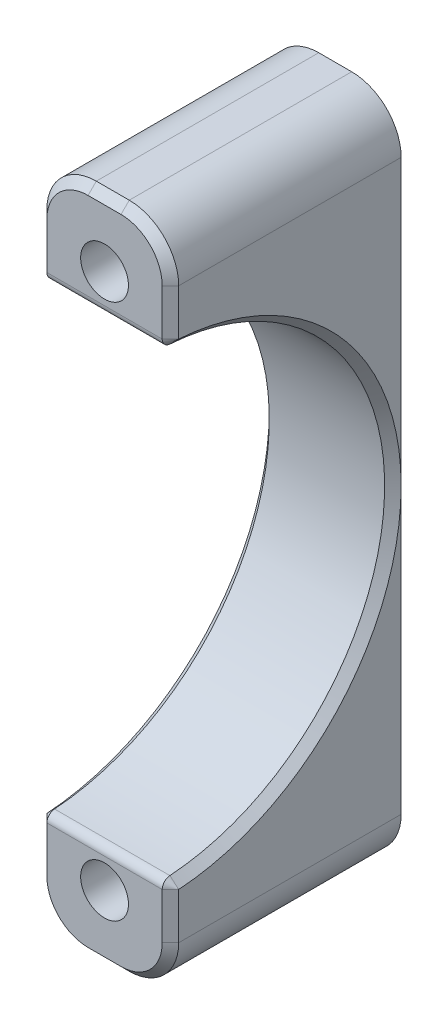
ISO-10303-21;
HEADER;
FILE_DESCRIPTION(('STEP AP214'),'2;1');
FILE_NAME('part.step','',(''),(''),'','','');
FILE_SCHEMA(('AUTOMOTIVE_DESIGN { 1 0 10303 214 1 1 1 1 }'));
ENDSEC;
DATA;
#1=APPLICATION_CONTEXT('core data for automotive mechanical design processes');
#2=APPLICATION_PROTOCOL_DEFINITION('international standard','automotive_design',2000,#1);
#3=PRODUCT_CONTEXT('',#1,'mechanical');
#4=PRODUCT('Part','Part','',(#3));
#5=PRODUCT_RELATED_PRODUCT_CATEGORY('part','',(#4));
#6=PRODUCT_DEFINITION_FORMATION('','',#4);
#7=PRODUCT_DEFINITION_CONTEXT('part definition',#1,'design');
#8=PRODUCT_DEFINITION('design','',#6,#7);
#9=PRODUCT_DEFINITION_SHAPE('','',#8);
#10=(LENGTH_UNIT() NAMED_UNIT(*) SI_UNIT(.MILLI.,.METRE.));
#11=(NAMED_UNIT(*) PLANE_ANGLE_UNIT() SI_UNIT($,.RADIAN.));
#12=(NAMED_UNIT(*) SI_UNIT($,.STERADIAN.) SOLID_ANGLE_UNIT());
#13=UNCERTAINTY_MEASURE_WITH_UNIT(LENGTH_MEASURE(1.E-05),#10,'distance_accuracy_value','');
#14=(GEOMETRIC_REPRESENTATION_CONTEXT(3) GLOBAL_UNCERTAINTY_ASSIGNED_CONTEXT((#13)) GLOBAL_UNIT_ASSIGNED_CONTEXT((#10,
#11,#12)) REPRESENTATION_CONTEXT('',''));
#15=CARTESIAN_POINT('',(0.,0.,0.));
#16=DIRECTION('',(0.,0.,1.));
#17=DIRECTION('',(1.,0.,0.));
#18=AXIS2_PLACEMENT_3D('',#15,#16,#17);
#19=CARTESIAN_POINT('',(148.26488013173,17.2640458755163,14.));
#20=DIRECTION('',(1.,0.,0.));
#21=DIRECTION('',(0.,0.,-1.));
#22=AXIS2_PLACEMENT_3D('',#19,#20,#21);
#23=PLANE('',#22);
#24=DIRECTION('',(0.,0.,-1.));
#25=VECTOR('',#24,1.);
#26=CARTESIAN_POINT('',(148.26488013173,-17.2640458755164,14.));
#27=LINE('',#26,#25);
#28=CARTESIAN_POINT('',(148.26488013173,-17.2640458755164,13.5));
#29=VERTEX_POINT('',#28);
#30=CARTESIAN_POINT('',(148.26488013173,-17.2640458755164,0.));
#31=VERTEX_POINT('',#30);
#32=EDGE_CURVE('E224',#29,#31,#27,.T.);
#33=ORIENTED_EDGE('',*,*,#32,.F.);
#34=DIRECTION('',(0.,1.,0.));
#35=VECTOR('',#34,1.);
#36=CARTESIAN_POINT('',(148.26488013173,-14.4654761414894,13.5));
#37=LINE('',#36,#35);
#38=CARTESIAN_POINT('',(148.26488013173,-14.4654761414894,13.5));
#39=VERTEX_POINT('',#38);
#40=EDGE_CURVE('E11',#29,#39,#37,.T.);
#41=ORIENTED_EDGE('',*,*,#40,.T.);
#42=CARTESIAN_POINT('',(148.26488013173,0.,14.5));
#43=DIRECTION('',(1.,0.,0.));
#44=DIRECTION('',(0.,0.,-1.));
#45=AXIS2_PLACEMENT_3D('',#42,#43,#44);
#46=CIRCLE('',#45,14.5);
#47=CARTESIAN_POINT('',(148.26488013173,0.,0.));
#48=VERTEX_POINT('',#47);
#49=EDGE_CURVE('E299',#39,#48,#46,.T.);
#50=ORIENTED_EDGE('',*,*,#49,.T.);
#51=DIRECTION('',(0.,-1.,0.));
#52=VECTOR('',#51,1.);
#53=CARTESIAN_POINT('',(148.26488013173,17.2640458755163,0.));
#54=LINE('',#53,#52);
#55=EDGE_CURVE('E213',#48,#31,#54,.T.);
#56=ORIENTED_EDGE('',*,*,#55,.T.);
#57=EDGE_LOOP('',(#33,#41,#50,#56));
#58=FACE_BOUND('',#57,.T.);
#59=ADVANCED_FACE('F36',(#58),#23,.F.);
#60=CARTESIAN_POINT('',(156.26488013173,17.2640458755163,14.));
#61=DIRECTION('',(-1.,0.,0.));
#62=DIRECTION('',(0.,-1.,0.));
#63=AXIS2_PLACEMENT_3D('',#60,#61,#62);
#64=PLANE('',#63);
#65=CARTESIAN_POINT('',(156.26488013173,0.,14.5));
#66=DIRECTION('',(-1.,0.,0.));
#67=DIRECTION('',(0.,-1.,0.));
#68=AXIS2_PLACEMENT_3D('',#65,#66,#67);
#69=CIRCLE('',#68,14.5);
#70=CARTESIAN_POINT('',(156.26488013173,0.,0.));
#71=VERTEX_POINT('',#70);
#72=CARTESIAN_POINT('',(156.26488013173,-14.4654761414894,13.5));
#73=VERTEX_POINT('',#72);
#74=EDGE_CURVE('E250',#71,#73,#69,.T.);
#75=ORIENTED_EDGE('',*,*,#74,.T.);
#76=DIRECTION('',(0.,-1.,0.));
#77=VECTOR('',#76,1.);
#78=CARTESIAN_POINT('',(156.26488013173,-17.2640458755164,13.5));
#79=LINE('',#78,#77);
#80=CARTESIAN_POINT('',(156.26488013173,-17.2640458755164,13.5));
#81=VERTEX_POINT('',#80);
#82=EDGE_CURVE('E175',#73,#81,#79,.T.);
#83=ORIENTED_EDGE('',*,*,#82,.T.);
#84=DIRECTION('',(0.,0.,-1.));
#85=VECTOR('',#84,1.);
#86=CARTESIAN_POINT('',(156.26488013173,-17.2640458755164,14.));
#87=LINE('',#86,#85);
#88=CARTESIAN_POINT('',(156.26488013173,-17.2640458755164,0.));
#89=VERTEX_POINT('',#88);
#90=EDGE_CURVE('E170',#81,#89,#87,.T.);
#91=ORIENTED_EDGE('',*,*,#90,.T.);
#92=DIRECTION('',(0.,1.,0.));
#93=VECTOR('',#92,1.);
#94=CARTESIAN_POINT('',(156.26488013173,17.2640458755163,0.));
#95=LINE('',#94,#93);
#96=EDGE_CURVE('E173',#89,#71,#95,.T.);
#97=ORIENTED_EDGE('',*,*,#96,.T.);
#98=EDGE_LOOP('',(#75,#83,#91,#97));
#99=FACE_BOUND('',#98,.T.);
#100=ADVANCED_FACE('F172',(#99),#64,.F.);
#101=CARTESIAN_POINT('',(153.26488013173,-17.2640458755164,14.));
#102=DIRECTION('',(0.,0.,1.));
#103=DIRECTION('',(1.,0.,0.));
#104=AXIS2_PLACEMENT_3D('',#101,#102,#103);
#105=PLANE('',#104);
#106=DIRECTION('',(1.,0.,0.));
#107=VECTOR('',#106,1.);
#108=CARTESIAN_POINT('',(156.26488013173,14.4654761414894,14.));
#109=LINE('',#108,#107);
#110=CARTESIAN_POINT('',(148.76488013173,14.4654761414894,14.));
#111=VERTEX_POINT('',#110);
#112=CARTESIAN_POINT('',(155.76488013173,14.4654761414894,14.));
#113=VERTEX_POINT('',#112);
#114=EDGE_CURVE('E242',#111,#113,#109,.T.);
#115=ORIENTED_EDGE('',*,*,#114,.T.);
#116=DIRECTION('',(0.,1.,0.));
#117=VECTOR('',#116,1.);
#118=CARTESIAN_POINT('',(155.76488013173,17.2640458755163,14.));
#119=LINE('',#118,#117);
#120=CARTESIAN_POINT('',(155.76488013173,17.2640458755163,14.));
#121=VERTEX_POINT('',#120);
#122=EDGE_CURVE('E284',#113,#121,#119,.T.);
#123=ORIENTED_EDGE('',*,*,#122,.T.);
#124=CARTESIAN_POINT('',(153.26488013173,17.2640458755163,14.));
#125=DIRECTION('',(0.,0.,1.));
#126=DIRECTION('',(1.,0.,0.));
#127=AXIS2_PLACEMENT_3D('',#124,#125,#126);
#128=CIRCLE('',#127,2.49999999999997);
#129=CARTESIAN_POINT('',(153.26488013173,19.7640458755163,14.));
#130=VERTEX_POINT('',#129);
#131=EDGE_CURVE('E282',#121,#130,#128,.T.);
#132=ORIENTED_EDGE('',*,*,#131,.T.);
#133=DIRECTION('',(-1.,0.,0.));
#134=VECTOR('',#133,1.);
#135=CARTESIAN_POINT('',(151.26488013173,19.7640458755163,14.));
#136=LINE('',#135,#134);
#137=CARTESIAN_POINT('',(151.26488013173,19.7640458755163,14.));
#138=VERTEX_POINT('',#137);
#139=EDGE_CURVE('E280',#130,#138,#136,.T.);
#140=ORIENTED_EDGE('',*,*,#139,.T.);
#141=CARTESIAN_POINT('',(151.26488013173,17.2640458755163,14.));
#142=DIRECTION('',(0.,0.,1.));
#143=DIRECTION('',(1.,0.,0.));
#144=AXIS2_PLACEMENT_3D('',#141,#142,#143);
#145=CIRCLE('',#144,2.49999999999997);
#146=CARTESIAN_POINT('',(148.76488013173,17.2640458755163,14.));
#147=VERTEX_POINT('',#146);
#148=EDGE_CURVE('E278',#138,#147,#145,.T.);
#149=ORIENTED_EDGE('',*,*,#148,.T.);
#150=DIRECTION('',(0.,-1.,0.));
#151=VECTOR('',#150,1.);
#152=CARTESIAN_POINT('',(148.76488013173,14.4654761414894,14.));
#153=LINE('',#152,#151);
#154=EDGE_CURVE('E276',#147,#111,#153,.T.);
#155=ORIENTED_EDGE('',*,*,#154,.T.);
#156=EDGE_LOOP('',(#115,#123,#132,#140,#149,#155));
#157=FACE_BOUND('',#156,.T.);
#158=CARTESIAN_POINT('',(152.26488013173,16.2640458755163,14.));
#159=DIRECTION('',(0.,0.,1.));
#160=DIRECTION('',(1.,0.,0.));
#161=AXIS2_PLACEMENT_3D('',#158,#159,#160);
#162=CIRCLE('',#161,1.45);
#163=CARTESIAN_POINT('',(153.71488013173,16.2640458755163,14.));
#164=VERTEX_POINT('',#163);
#165=EDGE_CURVE('E354',#164,#164,#162,.T.);
#166=ORIENTED_EDGE('',*,*,#165,.F.);
#167=EDGE_LOOP('',(#166));
#168=FACE_BOUND('',#167,.T.);
#169=ADVANCED_FACE('F387',(#157,#168),#105,.T.);
#170=CARTESIAN_POINT('',(153.26488013173,-17.2640458755164,14.));
#171=DIRECTION('',(0.,0.,1.));
#172=DIRECTION('',(1.,0.,0.));
#173=AXIS2_PLACEMENT_3D('',#170,#171,#172);
#174=CIRCLE('',#173,2.49999999999997);
#175=CARTESIAN_POINT('',(153.26488013173,-19.7640458755163,14.));
#176=VERTEX_POINT('',#175);
#177=CARTESIAN_POINT('',(155.76488013173,-17.2640458755164,14.));
#178=VERTEX_POINT('',#177);
#179=EDGE_CURVE('E272',#176,#178,#174,.T.);
#180=ORIENTED_EDGE('',*,*,#179,.T.);
#181=DIRECTION('',(0.,1.,0.));
#182=VECTOR('',#181,1.);
#183=CARTESIAN_POINT('',(155.76488013173,-14.4654761414894,14.));
#184=LINE('',#183,#182);
#185=CARTESIAN_POINT('',(155.76488013173,-14.4654761414894,14.));
#186=VERTEX_POINT('',#185);
#187=EDGE_CURVE('E274',#178,#186,#184,.T.);
#188=ORIENTED_EDGE('',*,*,#187,.T.);
#189=DIRECTION('',(1.,0.,0.));
#190=VECTOR('',#189,1.);
#191=CARTESIAN_POINT('',(148.26488013173,-14.4654761414894,14.));
#192=LINE('',#191,#190);
#193=CARTESIAN_POINT('',(148.76488013173,-14.4654761414894,14.));
#194=VERTEX_POINT('',#193);
#195=EDGE_CURVE('E239',#186,#194,#192,.F.);
#196=ORIENTED_EDGE('',*,*,#195,.T.);
#197=DIRECTION('',(0.,-1.,0.));
#198=VECTOR('',#197,1.);
#199=CARTESIAN_POINT('',(148.76488013173,-17.2640458755164,14.));
#200=LINE('',#199,#198);
#201=CARTESIAN_POINT('',(148.76488013173,-17.2640458755164,14.));
#202=VERTEX_POINT('',#201);
#203=EDGE_CURVE('E266',#194,#202,#200,.T.);
#204=ORIENTED_EDGE('',*,*,#203,.T.);
#205=CARTESIAN_POINT('',(151.26488013173,-17.2640458755164,14.));
#206=DIRECTION('',(0.,0.,1.));
#207=DIRECTION('',(1.,0.,0.));
#208=AXIS2_PLACEMENT_3D('',#205,#206,#207);
#209=CIRCLE('',#208,2.49999999999997);
#210=CARTESIAN_POINT('',(151.26488013173,-19.7640458755163,14.));
#211=VERTEX_POINT('',#210);
#212=EDGE_CURVE('E268',#202,#211,#209,.T.);
#213=ORIENTED_EDGE('',*,*,#212,.T.);
#214=DIRECTION('',(1.,0.,0.));
#215=VECTOR('',#214,1.);
#216=CARTESIAN_POINT('',(153.26488013173,-19.7640458755163,14.));
#217=LINE('',#216,#215);
#218=EDGE_CURVE('E270',#211,#176,#217,.T.);
#219=ORIENTED_EDGE('',*,*,#218,.T.);
#220=EDGE_LOOP('',(#180,#188,#196,#204,#213,#219));
#221=FACE_BOUND('',#220,.T.);
#222=CARTESIAN_POINT('',(152.26488013173,-16.2640458755164,14.));
#223=DIRECTION('',(0.,0.,1.));
#224=DIRECTION('',(1.,0.,0.));
#225=AXIS2_PLACEMENT_3D('',#222,#223,#224);
#226=CIRCLE('',#225,1.45);
#227=CARTESIAN_POINT('',(153.71488013173,-16.2640458755164,14.));
#228=VERTEX_POINT('',#227);
#229=EDGE_CURVE('E198',#228,#228,#226,.T.);
#230=ORIENTED_EDGE('',*,*,#229,.F.);
#231=EDGE_LOOP('',(#230));
#232=FACE_BOUND('',#231,.T.);
#233=ADVANCED_FACE('F537',(#221,#232),#105,.T.);
#234=CARTESIAN_POINT('',(153.26488013173,-17.2640458755164,0.));
#235=DIRECTION('',(0.,0.,1.));
#236=DIRECTION('',(1.,0.,0.));
#237=AXIS2_PLACEMENT_3D('',#234,#235,#236);
#238=PLANE('',#237);
#239=CARTESIAN_POINT('',(153.26488013173,-17.2640458755164,0.));
#240=DIRECTION('',(0.,0.,1.));
#241=DIRECTION('',(1.,0.,0.));
#242=AXIS2_PLACEMENT_3D('',#239,#240,#241);
#243=CIRCLE('',#242,3.);
#244=CARTESIAN_POINT('',(153.26488013173,-20.2640458755164,0.));
#245=VERTEX_POINT('',#244);
#246=EDGE_CURVE('E188',#245,#89,#243,.T.);
#247=ORIENTED_EDGE('',*,*,#246,.F.);
#248=DIRECTION('',(1.,0.,0.));
#249=VECTOR('',#248,1.);
#250=CARTESIAN_POINT('',(151.26488013173,-20.2640458755164,0.));
#251=LINE('',#250,#249);
#252=CARTESIAN_POINT('',(151.26488013173,-20.2640458755164,0.));
#253=VERTEX_POINT('',#252);
#254=EDGE_CURVE('E219',#253,#245,#251,.T.);
#255=ORIENTED_EDGE('',*,*,#254,.F.);
#256=CARTESIAN_POINT('',(151.26488013173,-17.2640458755164,0.));
#257=DIRECTION('',(0.,0.,1.));
#258=DIRECTION('',(1.,0.,0.));
#259=AXIS2_PLACEMENT_3D('',#256,#257,#258);
#260=CIRCLE('',#259,3.);
#261=EDGE_CURVE('E216',#31,#253,#260,.T.);
#262=ORIENTED_EDGE('',*,*,#261,.F.);
#263=ORIENTED_EDGE('',*,*,#55,.F.);
#264=CARTESIAN_POINT('',(148.26488013173,17.2640458755163,0.));
#265=VERTEX_POINT('',#264);
#266=EDGE_CURVE('E214',#265,#48,#54,.T.);
#267=ORIENTED_EDGE('',*,*,#266,.F.);
#268=CARTESIAN_POINT('',(151.26488013173,17.2640458755163,0.));
#269=DIRECTION('',(0.,0.,1.));
#270=DIRECTION('',(1.,0.,0.));
#271=AXIS2_PLACEMENT_3D('',#268,#269,#270);
#272=CIRCLE('',#271,3.);
#273=CARTESIAN_POINT('',(151.26488013173,20.2640458755163,0.));
#274=VERTEX_POINT('',#273);
#275=EDGE_CURVE('E210',#274,#265,#272,.T.);
#276=ORIENTED_EDGE('',*,*,#275,.F.);
#277=DIRECTION('',(-1.,0.,0.));
#278=VECTOR('',#277,1.);
#279=CARTESIAN_POINT('',(151.26488013173,20.2640458755163,0.));
#280=LINE('',#279,#278);
#281=CARTESIAN_POINT('',(153.26488013173,20.2640458755163,0.));
#282=VERTEX_POINT('',#281);
#283=EDGE_CURVE('E207',#282,#274,#280,.T.);
#284=ORIENTED_EDGE('',*,*,#283,.F.);
#285=CARTESIAN_POINT('',(153.26488013173,17.2640458755163,0.));
#286=DIRECTION('',(0.,0.,1.));
#287=DIRECTION('',(-1.,0.,0.));
#288=AXIS2_PLACEMENT_3D('',#285,#286,#287);
#289=CIRCLE('',#288,3.);
#290=CARTESIAN_POINT('',(156.26488013173,17.2640458755163,0.));
#291=VERTEX_POINT('',#290);
#292=EDGE_CURVE('E192',#291,#282,#289,.T.);
#293=ORIENTED_EDGE('',*,*,#292,.F.);
#294=EDGE_CURVE('E191',#71,#291,#95,.T.);
#295=ORIENTED_EDGE('',*,*,#294,.F.);
#296=ORIENTED_EDGE('',*,*,#96,.F.);
#297=EDGE_LOOP('',(#247,#255,#262,#263,#267,#276,#284,#293,#295,#296));
#298=FACE_BOUND('',#297,.T.);
#299=CARTESIAN_POINT('',(152.26488013173,-16.2640458755164,0.));
#300=DIRECTION('',(0.,0.,1.));
#301=DIRECTION('',(1.,0.,0.));
#302=AXIS2_PLACEMENT_3D('',#299,#300,#301);
#303=CIRCLE('',#302,1.45);
#304=CARTESIAN_POINT('',(153.71488013173,-16.2640458755164,0.));
#305=VERTEX_POINT('',#304);
#306=EDGE_CURVE('E201',#305,#305,#303,.T.);
#307=ORIENTED_EDGE('',*,*,#306,.T.);
#308=EDGE_LOOP('',(#307));
#309=FACE_BOUND('',#308,.T.);
#310=CARTESIAN_POINT('',(152.26488013173,16.2640458755163,0.));
#311=DIRECTION('',(0.,0.,1.));
#312=DIRECTION('',(1.,0.,0.));
#313=AXIS2_PLACEMENT_3D('',#310,#311,#312);
#314=CIRCLE('',#313,1.45);
#315=CARTESIAN_POINT('',(153.71488013173,16.2640458755163,0.));
#316=VERTEX_POINT('',#315);
#317=EDGE_CURVE('E349',#316,#316,#314,.T.);
#318=ORIENTED_EDGE('',*,*,#317,.T.);
#319=EDGE_LOOP('',(#318));
#320=FACE_BOUND('',#319,.T.);
#321=ADVANCED_FACE('F185',(#298,#309,#320),#238,.F.);
#322=CARTESIAN_POINT('',(153.26488013173,-17.2640458755164,14.));
#323=DIRECTION('',(0.,0.,-1.));
#324=DIRECTION('',(-1.,0.,0.));
#325=AXIS2_PLACEMENT_3D('',#322,#323,#324);
#326=CYLINDRICAL_SURFACE('',#325,3.);
#327=ORIENTED_EDGE('',*,*,#90,.F.);
#328=CARTESIAN_POINT('',(153.26488013173,-17.2640458755164,13.5));
#329=DIRECTION('',(0.,0.,1.));
#330=DIRECTION('',(1.,0.,0.));
#331=AXIS2_PLACEMENT_3D('',#328,#329,#330);
#332=CIRCLE('',#331,3.);
#333=CARTESIAN_POINT('',(153.26488013173,-20.2640458755164,13.5));
#334=VERTEX_POINT('',#333);
#335=EDGE_CURVE('E286',#81,#334,#332,.F.);
#336=ORIENTED_EDGE('',*,*,#335,.T.);
#337=DIRECTION('',(0.,0.,-1.));
#338=VECTOR('',#337,1.);
#339=CARTESIAN_POINT('',(153.26488013173,-20.2640458755164,14.));
#340=LINE('',#339,#338);
#341=EDGE_CURVE('E196',#334,#245,#340,.T.);
#342=ORIENTED_EDGE('',*,*,#341,.T.);
#343=ORIENTED_EDGE('',*,*,#246,.T.);
#344=EDGE_LOOP('',(#327,#336,#342,#343));
#345=FACE_BOUND('',#344,.T.);
#346=ADVANCED_FACE('F194',(#345),#326,.T.);
#347=DIRECTION('',(0.,-1.,0.));
#348=VECTOR('',#347,1.);
#349=CARTESIAN_POINT('',(156.26488013173,14.4654761414894,13.5));
#350=LINE('',#349,#348);
#351=CARTESIAN_POINT('',(156.26488013173,17.2640458755163,13.5));
#352=VERTEX_POINT('',#351);
#353=CARTESIAN_POINT('',(156.26488013173,14.4654761414894,13.5));
#354=VERTEX_POINT('',#353);
#355=EDGE_CURVE('E245',#352,#354,#350,.T.);
#356=ORIENTED_EDGE('',*,*,#355,.T.);
#357=CARTESIAN_POINT('',(156.26488013173,0.,14.5));
#358=DIRECTION('',(-1.,0.,0.));
#359=DIRECTION('',(0.,-1.,0.));
#360=AXIS2_PLACEMENT_3D('',#357,#358,#359);
#361=CIRCLE('',#360,14.5);
#362=EDGE_CURVE('E247',#354,#71,#361,.T.);
#363=ORIENTED_EDGE('',*,*,#362,.T.);
#364=ORIENTED_EDGE('',*,*,#294,.T.);
#365=DIRECTION('',(0.,0.,-1.));
#366=VECTOR('',#365,1.);
#367=CARTESIAN_POINT('',(156.26488013173,17.2640458755163,14.));
#368=LINE('',#367,#366);
#369=EDGE_CURVE('E180',#352,#291,#368,.T.);
#370=ORIENTED_EDGE('',*,*,#369,.F.);
#371=EDGE_LOOP('',(#356,#363,#364,#370));
#372=FACE_BOUND('',#371,.T.);
#373=ADVANCED_FACE('F389',(#372),#64,.F.);
#374=CARTESIAN_POINT('',(153.26488013173,17.2640458755163,14.));
#375=DIRECTION('',(0.,0.,-1.));
#376=DIRECTION('',(-1.,0.,0.));
#377=AXIS2_PLACEMENT_3D('',#374,#375,#376);
#378=CYLINDRICAL_SURFACE('',#377,3.);
#379=DIRECTION('',(0.,0.,-1.));
#380=VECTOR('',#379,1.);
#381=CARTESIAN_POINT('',(153.26488013173,20.2640458755163,14.));
#382=LINE('',#381,#380);
#383=CARTESIAN_POINT('',(153.26488013173,20.2640458755163,13.5));
#384=VERTEX_POINT('',#383);
#385=EDGE_CURVE('E231',#384,#282,#382,.T.);
#386=ORIENTED_EDGE('',*,*,#385,.F.);
#387=CARTESIAN_POINT('',(153.26488013173,17.2640458755163,13.5));
#388=DIRECTION('',(0.,0.,1.));
#389=DIRECTION('',(1.,0.,0.));
#390=AXIS2_PLACEMENT_3D('',#387,#388,#389);
#391=CIRCLE('',#390,3.);
#392=EDGE_CURVE('E288',#384,#352,#391,.F.);
#393=ORIENTED_EDGE('',*,*,#392,.T.);
#394=ORIENTED_EDGE('',*,*,#369,.T.);
#395=ORIENTED_EDGE('',*,*,#292,.T.);
#396=EDGE_LOOP('',(#386,#393,#394,#395));
#397=FACE_BOUND('',#396,.T.);
#398=ADVANCED_FACE('F404',(#397),#378,.T.);
#399=CARTESIAN_POINT('',(151.26488013173,20.2640458755163,14.));
#400=DIRECTION('',(0.,-1.,0.));
#401=DIRECTION('',(0.,0.,-1.));
#402=AXIS2_PLACEMENT_3D('',#399,#400,#401);
#403=PLANE('',#402);
#404=DIRECTION('',(0.,0.,-1.));
#405=VECTOR('',#404,1.);
#406=CARTESIAN_POINT('',(151.26488013173,20.2640458755163,14.));
#407=LINE('',#406,#405);
#408=CARTESIAN_POINT('',(151.26488013173,20.2640458755163,13.5));
#409=VERTEX_POINT('',#408);
#410=EDGE_CURVE('E229',#409,#274,#407,.T.);
#411=ORIENTED_EDGE('',*,*,#410,.F.);
#412=DIRECTION('',(1.,0.,0.));
#413=VECTOR('',#412,1.);
#414=CARTESIAN_POINT('',(153.26488013173,20.2640458755163,13.5));
#415=LINE('',#414,#413);
#416=EDGE_CURVE('E292',#409,#384,#415,.T.);
#417=ORIENTED_EDGE('',*,*,#416,.T.);
#418=ORIENTED_EDGE('',*,*,#385,.T.);
#419=ORIENTED_EDGE('',*,*,#283,.T.);
#420=EDGE_LOOP('',(#411,#417,#418,#419));
#421=FACE_BOUND('',#420,.T.);
#422=ADVANCED_FACE('F399',(#421),#403,.F.);
#423=CARTESIAN_POINT('',(151.26488013173,17.2640458755163,14.));
#424=DIRECTION('',(0.,0.,-1.));
#425=DIRECTION('',(-1.,0.,0.));
#426=AXIS2_PLACEMENT_3D('',#423,#424,#425);
#427=CYLINDRICAL_SURFACE('',#426,3.);
#428=DIRECTION('',(0.,0.,-1.));
#429=VECTOR('',#428,1.);
#430=CARTESIAN_POINT('',(148.26488013173,17.2640458755163,14.));
#431=LINE('',#430,#429);
#432=CARTESIAN_POINT('',(148.26488013173,17.2640458755163,13.5));
#433=VERTEX_POINT('',#432);
#434=EDGE_CURVE('E227',#433,#265,#431,.T.);
#435=ORIENTED_EDGE('',*,*,#434,.F.);
#436=CARTESIAN_POINT('',(151.26488013173,17.2640458755163,13.5));
#437=DIRECTION('',(0.,0.,1.));
#438=DIRECTION('',(1.,0.,0.));
#439=AXIS2_PLACEMENT_3D('',#436,#437,#438);
#440=CIRCLE('',#439,3.);
#441=EDGE_CURVE('E296',#433,#409,#440,.F.);
#442=ORIENTED_EDGE('',*,*,#441,.T.);
#443=ORIENTED_EDGE('',*,*,#410,.T.);
#444=ORIENTED_EDGE('',*,*,#275,.T.);
#445=EDGE_LOOP('',(#435,#442,#443,#444));
#446=FACE_BOUND('',#445,.T.);
#447=ADVANCED_FACE('F393',(#446),#427,.T.);
#448=CARTESIAN_POINT('',(148.26488013173,0.,14.5));
#449=DIRECTION('',(1.,0.,0.));
#450=DIRECTION('',(0.,0.,-1.));
#451=AXIS2_PLACEMENT_3D('',#448,#449,#450);
#452=CIRCLE('',#451,14.5);
#453=CARTESIAN_POINT('',(148.26488013173,14.4654761414894,13.5));
#454=VERTEX_POINT('',#453);
#455=EDGE_CURVE('E60',#48,#454,#452,.T.);
#456=ORIENTED_EDGE('',*,*,#455,.T.);
#457=DIRECTION('',(0.,1.,0.));
#458=VECTOR('',#457,1.);
#459=CARTESIAN_POINT('',(148.26488013173,17.2640458755163,13.5));
#460=LINE('',#459,#458);
#461=EDGE_CURVE('E46',#454,#433,#460,.T.);
#462=ORIENTED_EDGE('',*,*,#461,.T.);
#463=ORIENTED_EDGE('',*,*,#434,.T.);
#464=ORIENTED_EDGE('',*,*,#266,.T.);
#465=EDGE_LOOP('',(#456,#462,#463,#464));
#466=FACE_BOUND('',#465,.T.);
#467=ADVANCED_FACE('F383',(#466),#23,.F.);
#468=CARTESIAN_POINT('',(151.26488013173,-17.2640458755164,14.));
#469=DIRECTION('',(0.,0.,-1.));
#470=DIRECTION('',(-1.,0.,0.));
#471=AXIS2_PLACEMENT_3D('',#468,#469,#470);
#472=CYLINDRICAL_SURFACE('',#471,3.);
#473=DIRECTION('',(0.,0.,-1.));
#474=VECTOR('',#473,1.);
#475=CARTESIAN_POINT('',(151.26488013173,-20.2640458755164,14.));
#476=LINE('',#475,#474);
#477=CARTESIAN_POINT('',(151.26488013173,-20.2640458755164,13.5));
#478=VERTEX_POINT('',#477);
#479=EDGE_CURVE('E222',#478,#253,#476,.T.);
#480=ORIENTED_EDGE('',*,*,#479,.F.);
#481=CARTESIAN_POINT('',(151.26488013173,-17.2640458755164,13.5));
#482=DIRECTION('',(0.,0.,1.));
#483=DIRECTION('',(1.,0.,0.));
#484=AXIS2_PLACEMENT_3D('',#481,#482,#483);
#485=CIRCLE('',#484,3.);
#486=EDGE_CURVE('E294',#478,#29,#485,.F.);
#487=ORIENTED_EDGE('',*,*,#486,.T.);
#488=ORIENTED_EDGE('',*,*,#32,.T.);
#489=ORIENTED_EDGE('',*,*,#261,.T.);
#490=EDGE_LOOP('',(#480,#487,#488,#489));
#491=FACE_BOUND('',#490,.T.);
#492=ADVANCED_FACE('F377',(#491),#472,.T.);
#493=CARTESIAN_POINT('',(151.26488013173,-20.2640458755164,14.));
#494=DIRECTION('',(0.,1.,0.));
#495=DIRECTION('',(0.,0.,1.));
#496=AXIS2_PLACEMENT_3D('',#493,#494,#495);
#497=PLANE('',#496);
#498=ORIENTED_EDGE('',*,*,#341,.F.);
#499=DIRECTION('',(-1.,0.,0.));
#500=VECTOR('',#499,1.);
#501=CARTESIAN_POINT('',(151.26488013173,-20.2640458755164,13.5));
#502=LINE('',#501,#500);
#503=EDGE_CURVE('E290',#334,#478,#502,.T.);
#504=ORIENTED_EDGE('',*,*,#503,.T.);
#505=ORIENTED_EDGE('',*,*,#479,.T.);
#506=ORIENTED_EDGE('',*,*,#254,.T.);
#507=EDGE_LOOP('',(#498,#504,#505,#506));
#508=FACE_BOUND('',#507,.T.);
#509=ADVANCED_FACE('F368',(#508),#497,.F.);
#510=CARTESIAN_POINT('',(152.26488013173,-16.2640458755164,14.));
#511=DIRECTION('',(0.,0.,-1.));
#512=DIRECTION('',(-1.,0.,0.));
#513=AXIS2_PLACEMENT_3D('',#510,#511,#512);
#514=CYLINDRICAL_SURFACE('',#513,1.45);
#515=ORIENTED_EDGE('',*,*,#229,.T.);
#516=EDGE_LOOP('',(#515));
#517=FACE_BOUND('',#516,.T.);
#518=ORIENTED_EDGE('',*,*,#306,.F.);
#519=EDGE_LOOP('',(#518));
#520=FACE_BOUND('',#519,.T.);
#521=ADVANCED_FACE('F365',(#517,#520),#514,.F.);
#522=CARTESIAN_POINT('',(152.26488013173,16.2640458755163,14.));
#523=DIRECTION('',(0.,0.,-1.));
#524=DIRECTION('',(-1.,0.,0.));
#525=AXIS2_PLACEMENT_3D('',#522,#523,#524);
#526=CYLINDRICAL_SURFACE('',#525,1.45);
#527=ORIENTED_EDGE('',*,*,#165,.T.);
#528=EDGE_LOOP('',(#527));
#529=FACE_BOUND('',#528,.T.);
#530=ORIENTED_EDGE('',*,*,#317,.F.);
#531=EDGE_LOOP('',(#530));
#532=FACE_BOUND('',#531,.T.);
#533=ADVANCED_FACE('F367',(#529,#532),#526,.F.);
#534=CARTESIAN_POINT('',(156.26488013173,0.,14.5));
#535=DIRECTION('',(-1.,0.,0.));
#536=DIRECTION('',(0.,0.,1.));
#537=AXIS2_PLACEMENT_3D('',#534,#535,#536);
#538=CYLINDRICAL_SURFACE('',#537,14.);
#539=DIRECTION('',(-1.,0.,0.));
#540=VECTOR('',#539,1.);
#541=CARTESIAN_POINT('',(156.26488013173,-13.9666666193691,13.5344827586207));
#542=LINE('',#541,#540);
#543=CARTESIAN_POINT('',(148.76488013173,-13.9666666193691,13.5344827586207));
#544=VERTEX_POINT('',#543);
#545=CARTESIAN_POINT('',(155.76488013173,-13.9666666193691,13.5344827586207));
#546=VERTEX_POINT('',#545);
#547=EDGE_CURVE('E236',#544,#546,#542,.F.);
#548=ORIENTED_EDGE('',*,*,#547,.T.);
#549=CARTESIAN_POINT('',(155.76488013173,0.,14.5));
#550=DIRECTION('',(-1.,0.,0.));
#551=DIRECTION('',(0.,0.,1.));
#552=AXIS2_PLACEMENT_3D('',#549,#550,#551);
#553=CIRCLE('',#552,14.);
#554=CARTESIAN_POINT('',(155.76488013173,13.9666666193691,13.5344827586207));
#555=VERTEX_POINT('',#554);
#556=EDGE_CURVE('E255',#546,#555,#553,.F.);
#557=ORIENTED_EDGE('',*,*,#556,.T.);
#558=DIRECTION('',(-1.,0.,0.));
#559=VECTOR('',#558,1.);
#560=CARTESIAN_POINT('',(156.26488013173,13.9666666193691,13.5344827586207));
#561=LINE('',#560,#559);
#562=CARTESIAN_POINT('',(148.76488013173,13.9666666193691,13.5344827586207));
#563=VERTEX_POINT('',#562);
#564=EDGE_CURVE('E179',#555,#563,#561,.T.);
#565=ORIENTED_EDGE('',*,*,#564,.T.);
#566=CARTESIAN_POINT('',(148.76488013173,0.,14.5));
#567=DIRECTION('',(1.,0.,0.));
#568=DIRECTION('',(0.,0.,-1.));
#569=AXIS2_PLACEMENT_3D('',#566,#567,#568);
#570=CIRCLE('',#569,14.);
#571=EDGE_CURVE('E253',#563,#544,#570,.F.);
#572=ORIENTED_EDGE('',*,*,#571,.T.);
#573=EDGE_LOOP('',(#548,#557,#565,#572));
#574=FACE_BOUND('',#573,.T.);
#575=ADVANCED_FACE('F375',(#574),#538,.F.);
#576=CARTESIAN_POINT('',(156.26488013173,-14.4654761414894,13.5));
#577=DIRECTION('',(-1.,0.,0.));
#578=DIRECTION('',(0.,0.,1.));
#579=AXIS2_PLACEMENT_3D('',#576,#577,#578);
#580=CYLINDRICAL_SURFACE('',#579,0.5);
#581=ORIENTED_EDGE('',*,*,#195,.F.);
#582=CARTESIAN_POINT('',(155.76488013173,-14.4654761414894,13.5));
#583=DIRECTION('',(-1.,0.,0.));
#584=DIRECTION('',(0.,-1.,0.));
#585=AXIS2_PLACEMENT_3D('',#582,#583,#584);
#586=CIRCLE('',#585,0.5);
#587=EDGE_CURVE('E260',#186,#546,#586,.T.);
#588=ORIENTED_EDGE('',*,*,#587,.T.);
#589=ORIENTED_EDGE('',*,*,#547,.F.);
#590=CARTESIAN_POINT('',(148.76488013173,-14.4654761414894,13.5));
#591=DIRECTION('',(1.,0.,0.));
#592=DIRECTION('',(0.,0.,-1.));
#593=AXIS2_PLACEMENT_3D('',#590,#591,#592);
#594=CIRCLE('',#593,0.5);
#595=EDGE_CURVE('E258',#544,#194,#594,.T.);
#596=ORIENTED_EDGE('',*,*,#595,.T.);
#597=EDGE_LOOP('',(#581,#588,#589,#596));
#598=FACE_BOUND('',#597,.T.);
#599=ADVANCED_FACE('F416',(#598),#580,.T.);
#600=CARTESIAN_POINT('',(156.26488013173,14.4654761414894,13.5));
#601=DIRECTION('',(-1.,0.,0.));
#602=DIRECTION('',(0.,0.,1.));
#603=AXIS2_PLACEMENT_3D('',#600,#601,#602);
#604=CYLINDRICAL_SURFACE('',#603,0.5);
#605=ORIENTED_EDGE('',*,*,#564,.F.);
#606=CARTESIAN_POINT('',(155.76488013173,14.4654761414894,13.5));
#607=DIRECTION('',(-1.,0.,0.));
#608=DIRECTION('',(0.,-1.,0.));
#609=AXIS2_PLACEMENT_3D('',#606,#607,#608);
#610=CIRCLE('',#609,0.5);
#611=EDGE_CURVE('E264',#555,#113,#610,.T.);
#612=ORIENTED_EDGE('',*,*,#611,.T.);
#613=ORIENTED_EDGE('',*,*,#114,.F.);
#614=CARTESIAN_POINT('',(148.76488013173,14.4654761414894,13.5));
#615=DIRECTION('',(1.,0.,0.));
#616=DIRECTION('',(0.,0.,-1.));
#617=AXIS2_PLACEMENT_3D('',#614,#615,#616);
#618=CIRCLE('',#617,0.5);
#619=EDGE_CURVE('E262',#111,#563,#618,.T.);
#620=ORIENTED_EDGE('',*,*,#619,.T.);
#621=EDGE_LOOP('',(#605,#612,#613,#620));
#622=FACE_BOUND('',#621,.T.);
#623=ADVANCED_FACE('F419',(#622),#604,.T.);
#624=CARTESIAN_POINT('',(148.26488013173,0.,14.5));
#625=DIRECTION('',(-1.,0.,0.));
#626=DIRECTION('',(0.,0.,1.));
#627=AXIS2_PLACEMENT_3D('',#624,#625,#626);
#628=CONICAL_SURFACE('',#627,14.5,0.785398163397435);
#629=DIRECTION('',(-0.707106781186556,-0.705423191223398,-0.0487659849094171));
#630=VECTOR('',#629,1.);
#631=CARTESIAN_POINT('',(148.76488013173,-13.9666666193691,13.5344827586207));
#632=LINE('',#631,#630);
#633=EDGE_CURVE('E342',#544,#39,#632,.T.);
#634=ORIENTED_EDGE('',*,*,#633,.F.);
#635=ORIENTED_EDGE('',*,*,#571,.F.);
#636=DIRECTION('',(0.707106781186556,-0.705423191223398,0.0487659849094171));
#637=VECTOR('',#636,1.);
#638=CARTESIAN_POINT('',(148.26488013173,14.4654761414894,13.5));
#639=LINE('',#638,#637);
#640=EDGE_CURVE('E41',#454,#563,#639,.T.);
#641=ORIENTED_EDGE('',*,*,#640,.F.);
#642=ORIENTED_EDGE('',*,*,#455,.F.);
#643=ORIENTED_EDGE('',*,*,#49,.F.);
#644=EDGE_LOOP('',(#634,#635,#641,#642,#643));
#645=FACE_BOUND('',#644,.T.);
#646=ADVANCED_FACE('F39',(#645),#628,.F.);
#647=CARTESIAN_POINT('',(148.76488013173,14.4654761414894,13.5));
#648=DIRECTION('',(1.,0.,0.));
#649=DIRECTION('',(0.,0.,-1.));
#650=AXIS2_PLACEMENT_3D('',#647,#648,#649);
#651=CONICAL_SURFACE('',#650,0.500000000000014,0.785398163397434);
#652=ORIENTED_EDGE('',*,*,#640,.T.);
#653=ORIENTED_EDGE('',*,*,#619,.F.);
#654=DIRECTION('',(0.707106781186557,0.,0.707106781186538));
#655=VECTOR('',#654,1.);
#656=CARTESIAN_POINT('',(148.26488013173,14.4654761414894,13.5));
#657=LINE('',#656,#655);
#658=EDGE_CURVE('E340',#454,#111,#657,.T.);
#659=ORIENTED_EDGE('',*,*,#658,.F.);
#660=EDGE_LOOP('',(#652,#653,#659));
#661=FACE_BOUND('',#660,.T.);
#662=ADVANCED_FACE('F521',(#661),#651,.T.);
#663=CARTESIAN_POINT('',(148.76488013173,-14.4654761414894,13.5));
#664=DIRECTION('',(1.,0.,0.));
#665=DIRECTION('',(0.,0.,-1.));
#666=AXIS2_PLACEMENT_3D('',#663,#664,#665);
#667=CONICAL_SURFACE('',#666,0.500000000000014,0.785398163397434);
#668=ORIENTED_EDGE('',*,*,#595,.F.);
#669=ORIENTED_EDGE('',*,*,#633,.T.);
#670=DIRECTION('',(-0.707106781186557,0.,-0.707106781186538));
#671=VECTOR('',#670,1.);
#672=CARTESIAN_POINT('',(148.76488013173,-14.4654761414894,14.));
#673=LINE('',#672,#671);
#674=EDGE_CURVE('E337',#194,#39,#673,.T.);
#675=ORIENTED_EDGE('',*,*,#674,.F.);
#676=EDGE_LOOP('',(#668,#669,#675));
#677=FACE_BOUND('',#676,.T.);
#678=ADVANCED_FACE('F515',(#677),#667,.T.);
#679=CARTESIAN_POINT('',(148.76488013173,-17.2640458755164,14.));
#680=DIRECTION('',(-0.707106781186538,0.,0.707106781186557));
#681=DIRECTION('',(0.,1.,0.));
#682=AXIS2_PLACEMENT_3D('',#679,#680,#681);
#683=PLANE('',#682);
#684=ORIENTED_EDGE('',*,*,#658,.T.);
#685=ORIENTED_EDGE('',*,*,#154,.F.);
#686=DIRECTION('',(0.707106781186557,0.,0.707106781186538));
#687=VECTOR('',#686,1.);
#688=CARTESIAN_POINT('',(148.26488013173,17.2640458755163,13.5));
#689=LINE('',#688,#687);
#690=EDGE_CURVE('E334',#433,#147,#689,.T.);
#691=ORIENTED_EDGE('',*,*,#690,.F.);
#692=ORIENTED_EDGE('',*,*,#461,.F.);
#693=EDGE_LOOP('',(#684,#685,#691,#692));
#694=FACE_BOUND('',#693,.T.);
#695=ADVANCED_FACE('F508',(#694),#683,.T.);
#696=CARTESIAN_POINT('',(148.76488013173,-17.2640458755164,14.));
#697=DIRECTION('',(-0.707106781186538,0.,0.707106781186557));
#698=DIRECTION('',(0.,1.,0.));
#699=AXIS2_PLACEMENT_3D('',#696,#697,#698);
#700=PLANE('',#699);
#701=ORIENTED_EDGE('',*,*,#674,.T.);
#702=ORIENTED_EDGE('',*,*,#40,.F.);
#703=DIRECTION('',(-0.707106781186557,0.,-0.707106781186538));
#704=VECTOR('',#703,1.);
#705=CARTESIAN_POINT('',(148.76488013173,-17.2640458755164,14.));
#706=LINE('',#705,#704);
#707=EDGE_CURVE('E331',#202,#29,#706,.T.);
#708=ORIENTED_EDGE('',*,*,#707,.F.);
#709=ORIENTED_EDGE('',*,*,#203,.F.);
#710=EDGE_LOOP('',(#701,#702,#708,#709));
#711=FACE_BOUND('',#710,.T.);
#712=ADVANCED_FACE('F501',(#711),#700,.T.);
#713=CARTESIAN_POINT('',(151.26488013173,17.2640458755163,14.));
#714=DIRECTION('',(0.,0.,-1.));
#715=DIRECTION('',(-1.,0.,0.));
#716=AXIS2_PLACEMENT_3D('',#713,#714,#715);
#717=CONICAL_SURFACE('',#716,2.49999999999997,0.78539816339746);
#718=ORIENTED_EDGE('',*,*,#690,.T.);
#719=ORIENTED_EDGE('',*,*,#148,.F.);
#720=DIRECTION('',(0.,-0.707106781186555,0.70710678118654));
#721=VECTOR('',#720,1.);
#722=CARTESIAN_POINT('',(151.26488013173,20.2640458755163,13.5));
#723=LINE('',#722,#721);
#724=EDGE_CURVE('E328',#409,#138,#723,.T.);
#725=ORIENTED_EDGE('',*,*,#724,.F.);
#726=ORIENTED_EDGE('',*,*,#441,.F.);
#727=EDGE_LOOP('',(#718,#719,#725,#726));
#728=FACE_BOUND('',#727,.T.);
#729=ADVANCED_FACE('F494',(#728),#717,.T.);
#730=CARTESIAN_POINT('',(151.26488013173,-17.2640458755164,14.));
#731=DIRECTION('',(0.,0.,-1.));
#732=DIRECTION('',(-1.,0.,0.));
#733=AXIS2_PLACEMENT_3D('',#730,#731,#732);
#734=CONICAL_SURFACE('',#733,2.49999999999997,0.785398163397464);
#735=ORIENTED_EDGE('',*,*,#707,.T.);
#736=ORIENTED_EDGE('',*,*,#486,.F.);
#737=DIRECTION('',(0.,-0.707106781186557,-0.707106781186538));
#738=VECTOR('',#737,1.);
#739=CARTESIAN_POINT('',(151.26488013173,-19.7640458755163,14.));
#740=LINE('',#739,#738);
#741=EDGE_CURVE('E325',#211,#478,#740,.T.);
#742=ORIENTED_EDGE('',*,*,#741,.F.);
#743=ORIENTED_EDGE('',*,*,#212,.F.);
#744=EDGE_LOOP('',(#735,#736,#742,#743));
#745=FACE_BOUND('',#744,.T.);
#746=ADVANCED_FACE('F487',(#745),#734,.T.);
#747=CARTESIAN_POINT('',(153.26488013173,19.7640458755163,14.));
#748=DIRECTION('',(0.,0.707106781186538,0.707106781186557));
#749=DIRECTION('',(1.,0.,0.));
#750=AXIS2_PLACEMENT_3D('',#747,#748,#749);
#751=PLANE('',#750);
#752=ORIENTED_EDGE('',*,*,#724,.T.);
#753=ORIENTED_EDGE('',*,*,#139,.F.);
#754=DIRECTION('',(0.,-0.707106781186557,0.707106781186538));
#755=VECTOR('',#754,1.);
#756=CARTESIAN_POINT('',(153.26488013173,20.2640458755163,13.5));
#757=LINE('',#756,#755);
#758=EDGE_CURVE('E322',#384,#130,#757,.T.);
#759=ORIENTED_EDGE('',*,*,#758,.F.);
#760=ORIENTED_EDGE('',*,*,#416,.F.);
#761=EDGE_LOOP('',(#752,#753,#759,#760));
#762=FACE_BOUND('',#761,.T.);
#763=ADVANCED_FACE('F480',(#762),#751,.T.);
#764=CARTESIAN_POINT('',(153.26488013173,-19.7640458755163,14.));
#765=DIRECTION('',(0.,-0.707106781186538,0.707106781186557));
#766=DIRECTION('',(-1.,0.,0.));
#767=AXIS2_PLACEMENT_3D('',#764,#765,#766);
#768=PLANE('',#767);
#769=ORIENTED_EDGE('',*,*,#741,.T.);
#770=ORIENTED_EDGE('',*,*,#503,.F.);
#771=DIRECTION('',(0.,-0.707106781186557,-0.707106781186538));
#772=VECTOR('',#771,1.);
#773=CARTESIAN_POINT('',(153.26488013173,-19.7640458755163,14.));
#774=LINE('',#773,#772);
#775=EDGE_CURVE('E319',#176,#334,#774,.T.);
#776=ORIENTED_EDGE('',*,*,#775,.F.);
#777=ORIENTED_EDGE('',*,*,#218,.F.);
#778=EDGE_LOOP('',(#769,#770,#776,#777));
#779=FACE_BOUND('',#778,.T.);
#780=ADVANCED_FACE('F473',(#779),#768,.T.);
#781=CARTESIAN_POINT('',(153.26488013173,17.2640458755163,14.));
#782=DIRECTION('',(0.,0.,-1.));
#783=DIRECTION('',(-1.,0.,0.));
#784=AXIS2_PLACEMENT_3D('',#781,#782,#783);
#785=CONICAL_SURFACE('',#784,2.49999999999997,0.785398163397464);
#786=ORIENTED_EDGE('',*,*,#758,.T.);
#787=ORIENTED_EDGE('',*,*,#131,.F.);
#788=DIRECTION('',(-0.707106781186557,0.,0.707106781186538));
#789=VECTOR('',#788,1.);
#790=CARTESIAN_POINT('',(156.26488013173,17.2640458755163,13.5));
#791=LINE('',#790,#789);
#792=EDGE_CURVE('E316',#352,#121,#791,.T.);
#793=ORIENTED_EDGE('',*,*,#792,.F.);
#794=ORIENTED_EDGE('',*,*,#392,.F.);
#795=EDGE_LOOP('',(#786,#787,#793,#794));
#796=FACE_BOUND('',#795,.T.);
#797=ADVANCED_FACE('F466',(#796),#785,.T.);
#798=CARTESIAN_POINT('',(153.26488013173,-17.2640458755164,14.));
#799=DIRECTION('',(0.,0.,-1.));
#800=DIRECTION('',(-1.,0.,0.));
#801=AXIS2_PLACEMENT_3D('',#798,#799,#800);
#802=CONICAL_SURFACE('',#801,2.49999999999997,0.78539816339746);
#803=ORIENTED_EDGE('',*,*,#775,.T.);
#804=ORIENTED_EDGE('',*,*,#335,.F.);
#805=DIRECTION('',(0.707106781186557,0.,-0.707106781186538));
#806=VECTOR('',#805,1.);
#807=CARTESIAN_POINT('',(155.76488013173,-17.2640458755164,14.));
#808=LINE('',#807,#806);
#809=EDGE_CURVE('E313',#178,#81,#808,.T.);
#810=ORIENTED_EDGE('',*,*,#809,.F.);
#811=ORIENTED_EDGE('',*,*,#179,.F.);
#812=EDGE_LOOP('',(#803,#804,#810,#811));
#813=FACE_BOUND('',#812,.T.);
#814=ADVANCED_FACE('F459',(#813),#802,.T.);
#815=CARTESIAN_POINT('',(155.76488013173,-17.2640458755164,14.));
#816=DIRECTION('',(0.707106781186538,0.,0.707106781186557));
#817=DIRECTION('',(0.,-1.,0.));
#818=AXIS2_PLACEMENT_3D('',#815,#816,#817);
#819=PLANE('',#818);
#820=ORIENTED_EDGE('',*,*,#792,.T.);
#821=ORIENTED_EDGE('',*,*,#122,.F.);
#822=DIRECTION('',(-0.707106781186557,0.,0.707106781186538));
#823=VECTOR('',#822,1.);
#824=CARTESIAN_POINT('',(156.26488013173,14.4654761414894,13.5));
#825=LINE('',#824,#823);
#826=EDGE_CURVE('E310',#354,#113,#825,.T.);
#827=ORIENTED_EDGE('',*,*,#826,.F.);
#828=ORIENTED_EDGE('',*,*,#355,.F.);
#829=EDGE_LOOP('',(#820,#821,#827,#828));
#830=FACE_BOUND('',#829,.T.);
#831=ADVANCED_FACE('F452',(#830),#819,.T.);
#832=CARTESIAN_POINT('',(155.76488013173,-17.2640458755164,14.));
#833=DIRECTION('',(0.707106781186538,0.,0.707106781186557));
#834=DIRECTION('',(0.,-1.,0.));
#835=AXIS2_PLACEMENT_3D('',#832,#833,#834);
#836=PLANE('',#835);
#837=ORIENTED_EDGE('',*,*,#809,.T.);
#838=ORIENTED_EDGE('',*,*,#82,.F.);
#839=DIRECTION('',(0.707106781186557,0.,-0.707106781186538));
#840=VECTOR('',#839,1.);
#841=CARTESIAN_POINT('',(155.76488013173,-14.4654761414894,14.));
#842=LINE('',#841,#840);
#843=EDGE_CURVE('E307',#186,#73,#842,.T.);
#844=ORIENTED_EDGE('',*,*,#843,.F.);
#845=ORIENTED_EDGE('',*,*,#187,.F.);
#846=EDGE_LOOP('',(#837,#838,#844,#845));
#847=FACE_BOUND('',#846,.T.);
#848=ADVANCED_FACE('F445',(#847),#836,.T.);
#849=CARTESIAN_POINT('',(155.76488013173,14.4654761414894,13.5));
#850=DIRECTION('',(-1.,0.,0.));
#851=DIRECTION('',(0.,-1.,0.));
#852=AXIS2_PLACEMENT_3D('',#849,#850,#851);
#853=CONICAL_SURFACE('',#852,0.500000000000014,0.785398163397437);
#854=ORIENTED_EDGE('',*,*,#826,.T.);
#855=ORIENTED_EDGE('',*,*,#611,.F.);
#856=DIRECTION('',(-0.707106781186575,-0.705423191223379,0.0487659849094159));
#857=VECTOR('',#856,1.);
#858=CARTESIAN_POINT('',(156.26488013173,14.4654761414894,13.5));
#859=LINE('',#858,#857);
#860=EDGE_CURVE('E305',#354,#555,#859,.T.);
#861=ORIENTED_EDGE('',*,*,#860,.F.);
#862=EDGE_LOOP('',(#854,#855,#861));
#863=FACE_BOUND('',#862,.T.);
#864=ADVANCED_FACE('F438',(#863),#853,.T.);
#865=CARTESIAN_POINT('',(155.76488013173,-14.4654761414894,13.5));
#866=DIRECTION('',(-1.,0.,0.));
#867=DIRECTION('',(0.,-1.,0.));
#868=AXIS2_PLACEMENT_3D('',#865,#866,#867);
#869=CONICAL_SURFACE('',#868,0.500000000000014,0.785398163397432);
#870=ORIENTED_EDGE('',*,*,#587,.F.);
#871=ORIENTED_EDGE('',*,*,#843,.T.);
#872=DIRECTION('',(0.707106781186575,-0.705423191223379,-0.0487659849094159));
#873=VECTOR('',#872,1.);
#874=CARTESIAN_POINT('',(155.76488013173,-13.9666666193691,13.5344827586207));
#875=LINE('',#874,#873);
#876=EDGE_CURVE('E302',#546,#73,#875,.T.);
#877=ORIENTED_EDGE('',*,*,#876,.F.);
#878=EDGE_LOOP('',(#870,#871,#877));
#879=FACE_BOUND('',#878,.T.);
#880=ADVANCED_FACE('F431',(#879),#869,.T.);
#881=CARTESIAN_POINT('',(156.26488013173,0.,14.5));
#882=DIRECTION('',(1.,0.,0.));
#883=DIRECTION('',(0.,0.,-1.));
#884=AXIS2_PLACEMENT_3D('',#881,#882,#883);
#885=CONICAL_SURFACE('',#884,14.5,0.785398163397435);
#886=ORIENTED_EDGE('',*,*,#860,.T.);
#887=ORIENTED_EDGE('',*,*,#556,.F.);
#888=ORIENTED_EDGE('',*,*,#876,.T.);
#889=ORIENTED_EDGE('',*,*,#74,.F.);
#890=ORIENTED_EDGE('',*,*,#362,.F.);
#891=EDGE_LOOP('',(#886,#887,#888,#889,#890));
#892=FACE_BOUND('',#891,.T.);
#893=ADVANCED_FACE('F425',(#892),#885,.F.);
#894=CLOSED_SHELL('',(#59,#100,#169,#233,#321,#346,#373,#398,#422,#447,#467,#492,#509,#521,#533,
#575,#599,#623,#646,#662,#678,#695,#712,#729,#746,#763,#780,#797,#814,#831,#848,#864,#880,#893));
#895=MANIFOLD_SOLID_BREP('B2',#894);
#896=ADVANCED_BREP_SHAPE_REPRESENTATION('',(#18,#895),#14);
#897=SHAPE_DEFINITION_REPRESENTATION(#9,#896);
ENDSEC;
END-ISO-10303-21;
